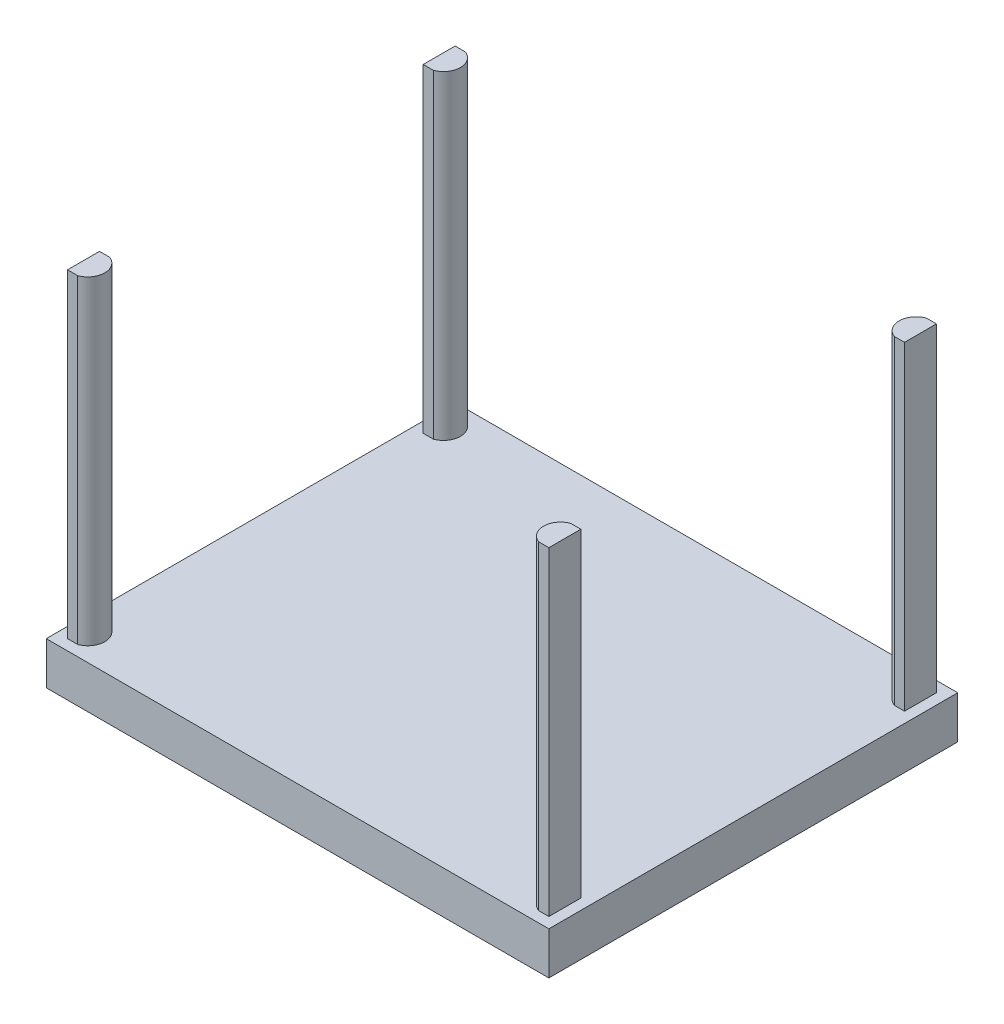
ISO-10303-21;
HEADER;
FILE_DESCRIPTION(('STEP AP214'),'2;1');
FILE_NAME('part.step','',(''),(''),'','','');
FILE_SCHEMA(('AUTOMOTIVE_DESIGN { 1 0 10303 214 1 1 1 1 }'));
ENDSEC;
DATA;
#1=APPLICATION_CONTEXT('core data for automotive mechanical design processes');
#2=APPLICATION_PROTOCOL_DEFINITION('international standard','automotive_design',2000,#1);
#3=PRODUCT_CONTEXT('',#1,'mechanical');
#4=PRODUCT('Part','Part','',(#3));
#5=PRODUCT_RELATED_PRODUCT_CATEGORY('part','',(#4));
#6=PRODUCT_DEFINITION_FORMATION('','',#4);
#7=PRODUCT_DEFINITION_CONTEXT('part definition',#1,'design');
#8=PRODUCT_DEFINITION('design','',#6,#7);
#9=PRODUCT_DEFINITION_SHAPE('','',#8);
#10=(LENGTH_UNIT() NAMED_UNIT(*) SI_UNIT(.MILLI.,.METRE.));
#11=(NAMED_UNIT(*) PLANE_ANGLE_UNIT() SI_UNIT($,.RADIAN.));
#12=(NAMED_UNIT(*) SI_UNIT($,.STERADIAN.) SOLID_ANGLE_UNIT());
#13=UNCERTAINTY_MEASURE_WITH_UNIT(LENGTH_MEASURE(1.E-05),#10,'distance_accuracy_value','');
#14=(GEOMETRIC_REPRESENTATION_CONTEXT(3) GLOBAL_UNCERTAINTY_ASSIGNED_CONTEXT((#13)) GLOBAL_UNIT_ASSIGNED_CONTEXT((#10,
#11,#12)) REPRESENTATION_CONTEXT('',''));
#15=CARTESIAN_POINT('',(0.,0.,0.));
#16=DIRECTION('',(0.,0.,1.));
#17=DIRECTION('',(1.,0.,0.));
#18=AXIS2_PLACEMENT_3D('',#15,#16,#17);
#19=CARTESIAN_POINT('',(0.,20.,0.));
#20=DIRECTION('',(0.,1.,0.));
#21=DIRECTION('',(0.,0.,1.));
#22=AXIS2_PLACEMENT_3D('',#19,#20,#21);
#23=PLANE('',#22);
#24=DIRECTION('',(0.,0.,1.));
#25=VECTOR('',#24,1.);
#26=CARTESIAN_POINT('',(-59.,20.,-48.));
#27=LINE('',#26,#25);
#28=CARTESIAN_POINT('',(-59.,20.,-48.));
#29=VERTEX_POINT('',#28);
#30=CARTESIAN_POINT('',(-59.,20.,144.));
#31=VERTEX_POINT('',#30);
#32=EDGE_CURVE('E326',#29,#31,#27,.T.);
#33=ORIENTED_EDGE('',*,*,#32,.T.);
#34=DIRECTION('',(-1.,0.,0.));
#35=VECTOR('',#34,1.);
#36=CARTESIAN_POINT('',(-59.,20.,144.));
#37=LINE('',#36,#35);
#38=CARTESIAN_POINT('',(177.,20.,144.));
#39=VERTEX_POINT('',#38);
#40=EDGE_CURVE('E286',#39,#31,#37,.T.);
#41=ORIENTED_EDGE('',*,*,#40,.F.);
#42=DIRECTION('',(0.,0.,1.));
#43=VECTOR('',#42,1.);
#44=CARTESIAN_POINT('',(177.,20.,-48.));
#45=LINE('',#44,#43);
#46=CARTESIAN_POINT('',(177.,20.,-48.));
#47=VERTEX_POINT('',#46);
#48=EDGE_CURVE('E246',#47,#39,#45,.T.);
#49=ORIENTED_EDGE('',*,*,#48,.F.);
#50=DIRECTION('',(-1.,0.,0.));
#51=VECTOR('',#50,1.);
#52=CARTESIAN_POINT('',(-59.,20.,-48.));
#53=LINE('',#52,#51);
#54=EDGE_CURVE('E45',#47,#29,#53,.T.);
#55=ORIENTED_EDGE('',*,*,#54,.T.);
#56=EDGE_LOOP('',(#33,#41,#49,#55));
#57=FACE_BOUND('',#56,.T.);
#58=DIRECTION('',(1.,0.,0.));
#59=VECTOR('',#58,1.);
#60=CARTESIAN_POINT('',(-1.24740713317382E-13,20.,-43.0000000000001));
#61=LINE('',#60,#59);
#62=CARTESIAN_POINT('',(-54.,20.,-43.));
#63=VERTEX_POINT('',#62);
#64=CARTESIAN_POINT('',(-49.216117818585,20.,-43.));
#65=VERTEX_POINT('',#64);
#66=EDGE_CURVE('E319',#63,#65,#61,.T.);
#67=ORIENTED_EDGE('',*,*,#66,.T.);
#68=CARTESIAN_POINT('',(-52.,20.,-35.5));
#69=DIRECTION('',(0.,1.,0.));
#70=DIRECTION('',(0.,0.,1.));
#71=AXIS2_PLACEMENT_3D('',#68,#69,#70);
#72=CIRCLE('',#71,8.);
#73=CARTESIAN_POINT('',(-49.216117818585,20.,-28.));
#74=VERTEX_POINT('',#73);
#75=EDGE_CURVE('E322',#65,#74,#72,.F.);
#76=ORIENTED_EDGE('',*,*,#75,.T.);
#77=DIRECTION('',(-1.,0.,0.));
#78=VECTOR('',#77,1.);
#79=CARTESIAN_POINT('',(-1.01533138746707E-13,20.,-28.0000000000002));
#80=LINE('',#79,#78);
#81=CARTESIAN_POINT('',(-54.,20.,-28.));
#82=VERTEX_POINT('',#81);
#83=EDGE_CURVE('E313',#74,#82,#80,.T.);
#84=ORIENTED_EDGE('',*,*,#83,.T.);
#85=DIRECTION('',(0.,0.,-1.));
#86=VECTOR('',#85,1.);
#87=CARTESIAN_POINT('',(-54.,20.,0.));
#88=LINE('',#87,#86);
#89=EDGE_CURVE('E316',#82,#63,#88,.T.);
#90=ORIENTED_EDGE('',*,*,#89,.T.);
#91=EDGE_LOOP('',(#67,#76,#84,#90));
#92=FACE_BOUND('',#91,.T.);
#93=DIRECTION('',(1.,0.,0.));
#94=VECTOR('',#93,1.);
#95=CARTESIAN_POINT('',(-1.03335989749397E-13,20.,139.));
#96=LINE('',#95,#94);
#97=CARTESIAN_POINT('',(-54.,20.,139.));
#98=VERTEX_POINT('',#97);
#99=CARTESIAN_POINT('',(-49.216117818585,20.,139.));
#100=VERTEX_POINT('',#99);
#101=EDGE_CURVE('E279',#98,#100,#96,.T.);
#102=ORIENTED_EDGE('',*,*,#101,.F.);
#103=DIRECTION('',(0.,0.,1.));
#104=VECTOR('',#103,1.);
#105=CARTESIAN_POINT('',(-54.,20.,96.));
#106=LINE('',#105,#104);
#107=CARTESIAN_POINT('',(-54.,20.,124.));
#108=VERTEX_POINT('',#107);
#109=EDGE_CURVE('E276',#108,#98,#106,.T.);
#110=ORIENTED_EDGE('',*,*,#109,.F.);
#111=DIRECTION('',(-1.,0.,0.));
#112=VECTOR('',#111,1.);
#113=CARTESIAN_POINT('',(0.,20.,124.));
#114=LINE('',#113,#112);
#115=CARTESIAN_POINT('',(-49.216117818585,20.,124.));
#116=VERTEX_POINT('',#115);
#117=EDGE_CURVE('E273',#116,#108,#114,.T.);
#118=ORIENTED_EDGE('',*,*,#117,.F.);
#119=CARTESIAN_POINT('',(-52.,20.,131.5));
#120=DIRECTION('',(0.,-1.,0.));
#121=DIRECTION('',(0.,0.,-1.));
#122=AXIS2_PLACEMENT_3D('',#119,#120,#121);
#123=CIRCLE('',#122,8.);
#124=EDGE_CURVE('E282',#100,#116,#123,.F.);
#125=ORIENTED_EDGE('',*,*,#124,.F.);
#126=EDGE_LOOP('',(#102,#110,#118,#125));
#127=FACE_BOUND('',#126,.T.);
#128=DIRECTION('',(-1.,0.,0.));
#129=VECTOR('',#128,1.);
#130=CARTESIAN_POINT('',(118.,20.,-43.0000000000001));
#131=LINE('',#130,#129);
#132=CARTESIAN_POINT('',(172.,20.,-43.));
#133=VERTEX_POINT('',#132);
#134=CARTESIAN_POINT('',(167.216117818585,20.,-43.));
#135=VERTEX_POINT('',#134);
#136=EDGE_CURVE('E239',#133,#135,#131,.T.);
#137=ORIENTED_EDGE('',*,*,#136,.F.);
#138=DIRECTION('',(0.,0.,-1.));
#139=VECTOR('',#138,1.);
#140=CARTESIAN_POINT('',(172.,20.,0.));
#141=LINE('',#140,#139);
#142=CARTESIAN_POINT('',(172.,20.,-28.));
#143=VERTEX_POINT('',#142);
#144=EDGE_CURVE('E236',#143,#133,#141,.T.);
#145=ORIENTED_EDGE('',*,*,#144,.F.);
#146=DIRECTION('',(1.,0.,0.));
#147=VECTOR('',#146,1.);
#148=CARTESIAN_POINT('',(118.,20.,-28.0000000000002));
#149=LINE('',#148,#147);
#150=CARTESIAN_POINT('',(167.216117818585,20.,-28.));
#151=VERTEX_POINT('',#150);
#152=EDGE_CURVE('E233',#151,#143,#149,.T.);
#153=ORIENTED_EDGE('',*,*,#152,.F.);
#154=CARTESIAN_POINT('',(170.,20.,-35.5));
#155=DIRECTION('',(0.,-1.,0.));
#156=DIRECTION('',(0.,0.,1.));
#157=AXIS2_PLACEMENT_3D('',#154,#155,#156);
#158=CIRCLE('',#157,8.);
#159=EDGE_CURVE('E242',#135,#151,#158,.F.);
#160=ORIENTED_EDGE('',*,*,#159,.F.);
#161=EDGE_LOOP('',(#137,#145,#153,#160));
#162=FACE_BOUND('',#161,.T.);
#163=DIRECTION('',(-1.,0.,0.));
#164=VECTOR('',#163,1.);
#165=CARTESIAN_POINT('',(118.,20.,139.));
#166=LINE('',#165,#164);
#167=CARTESIAN_POINT('',(172.,20.,139.));
#168=VERTEX_POINT('',#167);
#169=CARTESIAN_POINT('',(167.216117818585,20.,139.));
#170=VERTEX_POINT('',#169);
#171=EDGE_CURVE('E208',#168,#170,#166,.T.);
#172=ORIENTED_EDGE('',*,*,#171,.T.);
#173=CARTESIAN_POINT('',(170.,20.,131.5));
#174=DIRECTION('',(0.,1.,0.));
#175=DIRECTION('',(0.,0.,-1.));
#176=AXIS2_PLACEMENT_3D('',#173,#174,#175);
#177=CIRCLE('',#176,8.);
#178=CARTESIAN_POINT('',(167.216117818585,20.,124.));
#179=VERTEX_POINT('',#178);
#180=EDGE_CURVE('E195',#170,#179,#177,.F.);
#181=ORIENTED_EDGE('',*,*,#180,.T.);
#182=DIRECTION('',(1.,0.,0.));
#183=VECTOR('',#182,1.);
#184=CARTESIAN_POINT('',(118.,20.,124.));
#185=LINE('',#184,#183);
#186=CARTESIAN_POINT('',(172.,20.,124.));
#187=VERTEX_POINT('',#186);
#188=EDGE_CURVE('E197',#179,#187,#185,.T.);
#189=ORIENTED_EDGE('',*,*,#188,.T.);
#190=DIRECTION('',(0.,0.,1.));
#191=VECTOR('',#190,1.);
#192=CARTESIAN_POINT('',(172.,20.,96.));
#193=LINE('',#192,#191);
#194=EDGE_CURVE('E200',#187,#168,#193,.T.);
#195=ORIENTED_EDGE('',*,*,#194,.T.);
#196=EDGE_LOOP('',(#172,#181,#189,#195));
#197=FACE_BOUND('',#196,.T.);
#198=ADVANCED_FACE('F37',(#57,#92,#127,#162,#197),#23,.T.);
#199=CARTESIAN_POINT('',(-59.,20.,-48.));
#200=DIRECTION('',(1.,0.,0.));
#201=DIRECTION('',(0.,0.,-1.));
#202=AXIS2_PLACEMENT_3D('',#199,#200,#201);
#203=PLANE('',#202);
#204=DIRECTION('',(0.,0.,1.));
#205=VECTOR('',#204,1.);
#206=CARTESIAN_POINT('',(-59.,0.,-48.));
#207=LINE('',#206,#205);
#208=CARTESIAN_POINT('',(-59.,0.,-48.));
#209=VERTEX_POINT('',#208);
#210=CARTESIAN_POINT('',(-59.,0.,144.));
#211=VERTEX_POINT('',#210);
#212=EDGE_CURVE('E325',#209,#211,#207,.T.);
#213=ORIENTED_EDGE('',*,*,#212,.T.);
#214=DIRECTION('',(0.,-1.,0.));
#215=VECTOR('',#214,1.);
#216=CARTESIAN_POINT('',(-59.,20.,144.));
#217=LINE('',#216,#215);
#218=EDGE_CURVE('E289',#31,#211,#217,.T.);
#219=ORIENTED_EDGE('',*,*,#218,.F.);
#220=ORIENTED_EDGE('',*,*,#32,.F.);
#221=DIRECTION('',(0.,-1.,0.));
#222=VECTOR('',#221,1.);
#223=CARTESIAN_POINT('',(-59.,20.,-48.));
#224=LINE('',#223,#222);
#225=EDGE_CURVE('E11',#29,#209,#224,.T.);
#226=ORIENTED_EDGE('',*,*,#225,.T.);
#227=EDGE_LOOP('',(#213,#219,#220,#226));
#228=FACE_BOUND('',#227,.T.);
#229=ADVANCED_FACE('F39',(#228),#203,.F.);
#230=CARTESIAN_POINT('',(-59.,20.,-48.));
#231=DIRECTION('',(0.,0.,1.));
#232=DIRECTION('',(1.,0.,0.));
#233=AXIS2_PLACEMENT_3D('',#230,#231,#232);
#234=PLANE('',#233);
#235=DIRECTION('',(-1.,0.,0.));
#236=VECTOR('',#235,1.);
#237=CARTESIAN_POINT('',(-59.,0.,-48.));
#238=LINE('',#237,#236);
#239=CARTESIAN_POINT('',(177.,0.,-48.));
#240=VERTEX_POINT('',#239);
#241=EDGE_CURVE('E328',#240,#209,#238,.T.);
#242=ORIENTED_EDGE('',*,*,#241,.T.);
#243=ORIENTED_EDGE('',*,*,#225,.F.);
#244=ORIENTED_EDGE('',*,*,#54,.F.);
#245=DIRECTION('',(0.,-1.,0.));
#246=VECTOR('',#245,1.);
#247=CARTESIAN_POINT('',(177.,20.,-48.));
#248=LINE('',#247,#246);
#249=EDGE_CURVE('E249',#47,#240,#248,.T.);
#250=ORIENTED_EDGE('',*,*,#249,.T.);
#251=EDGE_LOOP('',(#242,#243,#244,#250));
#252=FACE_BOUND('',#251,.T.);
#253=ADVANCED_FACE('F331',(#252),#234,.F.);
#254=CARTESIAN_POINT('',(0.,0.,0.));
#255=DIRECTION('',(0.,1.,0.));
#256=DIRECTION('',(0.,0.,1.));
#257=AXIS2_PLACEMENT_3D('',#254,#255,#256);
#258=PLANE('',#257);
#259=ORIENTED_EDGE('',*,*,#212,.F.);
#260=ORIENTED_EDGE('',*,*,#241,.F.);
#261=DIRECTION('',(0.,0.,1.));
#262=VECTOR('',#261,1.);
#263=CARTESIAN_POINT('',(177.,0.,-48.));
#264=LINE('',#263,#262);
#265=CARTESIAN_POINT('',(177.,0.,144.));
#266=VERTEX_POINT('',#265);
#267=EDGE_CURVE('E245',#240,#266,#264,.T.);
#268=ORIENTED_EDGE('',*,*,#267,.T.);
#269=DIRECTION('',(-1.,0.,0.));
#270=VECTOR('',#269,1.);
#271=CARTESIAN_POINT('',(-59.,0.,144.));
#272=LINE('',#271,#270);
#273=EDGE_CURVE('E285',#266,#211,#272,.T.);
#274=ORIENTED_EDGE('',*,*,#273,.T.);
#275=EDGE_LOOP('',(#259,#260,#268,#274));
#276=FACE_BOUND('',#275,.T.);
#277=ADVANCED_FACE('F339',(#276),#258,.F.);
#278=CARTESIAN_POINT('',(-52.,170.,-35.5));
#279=DIRECTION('',(0.,-1.,0.));
#280=DIRECTION('',(0.,0.,-1.));
#281=AXIS2_PLACEMENT_3D('',#278,#279,#280);
#282=CYLINDRICAL_SURFACE('',#281,8.);
#283=ORIENTED_EDGE('',*,*,#75,.F.);
#284=DIRECTION('',(0.,-1.,0.));
#285=VECTOR('',#284,1.);
#286=CARTESIAN_POINT('',(-49.216117818585,170.,-43.));
#287=LINE('',#286,#285);
#288=CARTESIAN_POINT('',(-49.216117818585,170.,-43.));
#289=VERTEX_POINT('',#288);
#290=EDGE_CURVE('E310',#289,#65,#287,.T.);
#291=ORIENTED_EDGE('',*,*,#290,.F.);
#292=CARTESIAN_POINT('',(-52.,170.,-35.5));
#293=DIRECTION('',(0.,1.,0.));
#294=DIRECTION('',(0.,0.,-1.));
#295=AXIS2_PLACEMENT_3D('',#292,#293,#294);
#296=CIRCLE('',#295,8.);
#297=CARTESIAN_POINT('',(-49.216117818585,170.,-28.));
#298=VERTEX_POINT('',#297);
#299=EDGE_CURVE('E294',#298,#289,#296,.T.);
#300=ORIENTED_EDGE('',*,*,#299,.F.);
#301=DIRECTION('',(0.,-1.,0.));
#302=VECTOR('',#301,1.);
#303=CARTESIAN_POINT('',(-49.216117818585,170.,-28.));
#304=LINE('',#303,#302);
#305=EDGE_CURVE('E303',#298,#74,#304,.T.);
#306=ORIENTED_EDGE('',*,*,#305,.T.);
#307=EDGE_LOOP('',(#283,#291,#300,#306));
#308=FACE_BOUND('',#307,.T.);
#309=ADVANCED_FACE('F367',(#308),#282,.T.);
#310=CARTESIAN_POINT('',(-49.216117818585,170.,-43.));
#311=DIRECTION('',(0.,0.,1.));
#312=DIRECTION('',(1.,0.,0.));
#313=AXIS2_PLACEMENT_3D('',#310,#311,#312);
#314=PLANE('',#313);
#315=ORIENTED_EDGE('',*,*,#66,.F.);
#316=DIRECTION('',(0.,-1.,0.));
#317=VECTOR('',#316,1.);
#318=CARTESIAN_POINT('',(-54.,170.,-43.));
#319=LINE('',#318,#317);
#320=CARTESIAN_POINT('',(-54.,170.,-43.));
#321=VERTEX_POINT('',#320);
#322=EDGE_CURVE('E307',#321,#63,#319,.T.);
#323=ORIENTED_EDGE('',*,*,#322,.F.);
#324=DIRECTION('',(-1.,0.,0.));
#325=VECTOR('',#324,1.);
#326=CARTESIAN_POINT('',(-49.216117818585,170.,-43.));
#327=LINE('',#326,#325);
#328=EDGE_CURVE('E297',#289,#321,#327,.T.);
#329=ORIENTED_EDGE('',*,*,#328,.F.);
#330=ORIENTED_EDGE('',*,*,#290,.T.);
#331=EDGE_LOOP('',(#315,#323,#329,#330));
#332=FACE_BOUND('',#331,.T.);
#333=ADVANCED_FACE('F386',(#332),#314,.F.);
#334=CARTESIAN_POINT('',(-54.,170.,-28.));
#335=DIRECTION('',(1.,0.,0.));
#336=DIRECTION('',(0.,0.,-1.));
#337=AXIS2_PLACEMENT_3D('',#334,#335,#336);
#338=PLANE('',#337);
#339=ORIENTED_EDGE('',*,*,#89,.F.);
#340=DIRECTION('',(0.,-1.,0.));
#341=VECTOR('',#340,1.);
#342=CARTESIAN_POINT('',(-54.,170.,-28.));
#343=LINE('',#342,#341);
#344=CARTESIAN_POINT('',(-54.,170.,-28.));
#345=VERTEX_POINT('',#344);
#346=EDGE_CURVE('E52',#345,#82,#343,.T.);
#347=ORIENTED_EDGE('',*,*,#346,.F.);
#348=DIRECTION('',(0.,0.,1.));
#349=VECTOR('',#348,1.);
#350=CARTESIAN_POINT('',(-54.,170.,-28.));
#351=LINE('',#350,#349);
#352=EDGE_CURVE('E299',#321,#345,#351,.T.);
#353=ORIENTED_EDGE('',*,*,#352,.F.);
#354=ORIENTED_EDGE('',*,*,#322,.T.);
#355=EDGE_LOOP('',(#339,#347,#353,#354));
#356=FACE_BOUND('',#355,.T.);
#357=ADVANCED_FACE('F393',(#356),#338,.F.);
#358=CARTESIAN_POINT('',(-49.216117818585,170.,-28.));
#359=DIRECTION('',(0.,0.,-1.));
#360=DIRECTION('',(-1.,0.,0.));
#361=AXIS2_PLACEMENT_3D('',#358,#359,#360);
#362=PLANE('',#361);
#363=ORIENTED_EDGE('',*,*,#83,.F.);
#364=ORIENTED_EDGE('',*,*,#305,.F.);
#365=DIRECTION('',(1.,0.,0.));
#366=VECTOR('',#365,1.);
#367=CARTESIAN_POINT('',(-49.216117818585,170.,-28.));
#368=LINE('',#367,#366);
#369=EDGE_CURVE('E301',#345,#298,#368,.T.);
#370=ORIENTED_EDGE('',*,*,#369,.F.);
#371=ORIENTED_EDGE('',*,*,#346,.T.);
#372=EDGE_LOOP('',(#363,#364,#370,#371));
#373=FACE_BOUND('',#372,.T.);
#374=ADVANCED_FACE('F401',(#373),#362,.F.);
#375=CARTESIAN_POINT('',(-52.,170.,-35.5));
#376=DIRECTION('',(0.,-1.,0.));
#377=DIRECTION('',(0.,0.,-1.));
#378=AXIS2_PLACEMENT_3D('',#375,#376,#377);
#379=PLANE('',#378);
#380=ORIENTED_EDGE('',*,*,#299,.T.);
#381=ORIENTED_EDGE('',*,*,#328,.T.);
#382=ORIENTED_EDGE('',*,*,#352,.T.);
#383=ORIENTED_EDGE('',*,*,#369,.T.);
#384=EDGE_LOOP('',(#380,#381,#382,#383));
#385=FACE_BOUND('',#384,.T.);
#386=ADVANCED_FACE('F411',(#385),#379,.F.);
#387=CARTESIAN_POINT('',(-59.,20.,144.));
#388=DIRECTION('',(0.,0.,-1.));
#389=DIRECTION('',(1.,0.,0.));
#390=AXIS2_PLACEMENT_3D('',#387,#388,#389);
#391=PLANE('',#390);
#392=ORIENTED_EDGE('',*,*,#273,.F.);
#393=DIRECTION('',(0.,-1.,0.));
#394=VECTOR('',#393,1.);
#395=CARTESIAN_POINT('',(177.,20.,144.));
#396=LINE('',#395,#394);
#397=EDGE_CURVE('E211',#39,#266,#396,.T.);
#398=ORIENTED_EDGE('',*,*,#397,.F.);
#399=ORIENTED_EDGE('',*,*,#40,.T.);
#400=ORIENTED_EDGE('',*,*,#218,.T.);
#401=EDGE_LOOP('',(#392,#398,#399,#400));
#402=FACE_BOUND('',#401,.T.);
#403=ADVANCED_FACE('F342',(#402),#391,.F.);
#404=CARTESIAN_POINT('',(-52.,170.,131.5));
#405=DIRECTION('',(0.,-1.,0.));
#406=DIRECTION('',(0.,0.,1.));
#407=AXIS2_PLACEMENT_3D('',#404,#405,#406);
#408=CYLINDRICAL_SURFACE('',#407,8.);
#409=ORIENTED_EDGE('',*,*,#124,.T.);
#410=DIRECTION('',(0.,-1.,0.));
#411=VECTOR('',#410,1.);
#412=CARTESIAN_POINT('',(-49.216117818585,170.,124.));
#413=LINE('',#412,#411);
#414=CARTESIAN_POINT('',(-49.216117818585,170.,124.));
#415=VERTEX_POINT('',#414);
#416=EDGE_CURVE('E265',#415,#116,#413,.T.);
#417=ORIENTED_EDGE('',*,*,#416,.F.);
#418=CARTESIAN_POINT('',(-52.,170.,131.5));
#419=DIRECTION('',(0.,-1.,0.));
#420=DIRECTION('',(0.,0.,1.));
#421=AXIS2_PLACEMENT_3D('',#418,#419,#420);
#422=CIRCLE('',#421,8.);
#423=CARTESIAN_POINT('',(-49.216117818585,170.,139.));
#424=VERTEX_POINT('',#423);
#425=EDGE_CURVE('E254',#415,#424,#422,.T.);
#426=ORIENTED_EDGE('',*,*,#425,.T.);
#427=DIRECTION('',(0.,-1.,0.));
#428=VECTOR('',#427,1.);
#429=CARTESIAN_POINT('',(-49.216117818585,170.,139.));
#430=LINE('',#429,#428);
#431=EDGE_CURVE('E271',#424,#100,#430,.T.);
#432=ORIENTED_EDGE('',*,*,#431,.T.);
#433=EDGE_LOOP('',(#409,#417,#426,#432));
#434=FACE_BOUND('',#433,.T.);
#435=ADVANCED_FACE('F423',(#434),#408,.T.);
#436=CARTESIAN_POINT('',(-49.216117818585,170.,139.));
#437=DIRECTION('',(0.,0.,-1.));
#438=DIRECTION('',(1.,0.,0.));
#439=AXIS2_PLACEMENT_3D('',#436,#437,#438);
#440=PLANE('',#439);
#441=ORIENTED_EDGE('',*,*,#101,.T.);
#442=ORIENTED_EDGE('',*,*,#431,.F.);
#443=DIRECTION('',(-1.,0.,0.));
#444=VECTOR('',#443,1.);
#445=CARTESIAN_POINT('',(-49.216117818585,170.,139.));
#446=LINE('',#445,#444);
#447=CARTESIAN_POINT('',(-54.,170.,139.));
#448=VERTEX_POINT('',#447);
#449=EDGE_CURVE('E257',#424,#448,#446,.T.);
#450=ORIENTED_EDGE('',*,*,#449,.T.);
#451=DIRECTION('',(0.,-1.,0.));
#452=VECTOR('',#451,1.);
#453=CARTESIAN_POINT('',(-54.,170.,139.));
#454=LINE('',#453,#452);
#455=EDGE_CURVE('E269',#448,#98,#454,.T.);
#456=ORIENTED_EDGE('',*,*,#455,.T.);
#457=EDGE_LOOP('',(#441,#442,#450,#456));
#458=FACE_BOUND('',#457,.T.);
#459=ADVANCED_FACE('F430',(#458),#440,.F.);
#460=CARTESIAN_POINT('',(-54.,170.,124.));
#461=DIRECTION('',(1.,0.,0.));
#462=DIRECTION('',(0.,0.,1.));
#463=AXIS2_PLACEMENT_3D('',#460,#461,#462);
#464=PLANE('',#463);
#465=ORIENTED_EDGE('',*,*,#109,.T.);
#466=ORIENTED_EDGE('',*,*,#455,.F.);
#467=DIRECTION('',(0.,0.,-1.));
#468=VECTOR('',#467,1.);
#469=CARTESIAN_POINT('',(-54.,170.,124.));
#470=LINE('',#469,#468);
#471=CARTESIAN_POINT('',(-54.,170.,124.));
#472=VERTEX_POINT('',#471);
#473=EDGE_CURVE('E260',#448,#472,#470,.T.);
#474=ORIENTED_EDGE('',*,*,#473,.T.);
#475=DIRECTION('',(0.,-1.,0.));
#476=VECTOR('',#475,1.);
#477=CARTESIAN_POINT('',(-54.,170.,124.));
#478=LINE('',#477,#476);
#479=EDGE_CURVE('E267',#472,#108,#478,.T.);
#480=ORIENTED_EDGE('',*,*,#479,.T.);
#481=EDGE_LOOP('',(#465,#466,#474,#480));
#482=FACE_BOUND('',#481,.T.);
#483=ADVANCED_FACE('F439',(#482),#464,.F.);
#484=CARTESIAN_POINT('',(-49.216117818585,170.,124.));
#485=DIRECTION('',(0.,0.,1.));
#486=DIRECTION('',(-1.,0.,0.));
#487=AXIS2_PLACEMENT_3D('',#484,#485,#486);
#488=PLANE('',#487);
#489=ORIENTED_EDGE('',*,*,#117,.T.);
#490=ORIENTED_EDGE('',*,*,#479,.F.);
#491=DIRECTION('',(1.,0.,0.));
#492=VECTOR('',#491,1.);
#493=CARTESIAN_POINT('',(-49.216117818585,170.,124.));
#494=LINE('',#493,#492);
#495=EDGE_CURVE('E263',#472,#415,#494,.T.);
#496=ORIENTED_EDGE('',*,*,#495,.T.);
#497=ORIENTED_EDGE('',*,*,#416,.T.);
#498=EDGE_LOOP('',(#489,#490,#496,#497));
#499=FACE_BOUND('',#498,.T.);
#500=ADVANCED_FACE('F357',(#499),#488,.F.);
#501=CARTESIAN_POINT('',(-52.,170.,131.5));
#502=DIRECTION('',(0.,-1.,0.));
#503=DIRECTION('',(0.,0.,1.));
#504=AXIS2_PLACEMENT_3D('',#501,#502,#503);
#505=PLANE('',#504);
#506=ORIENTED_EDGE('',*,*,#425,.F.);
#507=ORIENTED_EDGE('',*,*,#495,.F.);
#508=ORIENTED_EDGE('',*,*,#473,.F.);
#509=ORIENTED_EDGE('',*,*,#449,.F.);
#510=EDGE_LOOP('',(#506,#507,#508,#509));
#511=FACE_BOUND('',#510,.T.);
#512=ADVANCED_FACE('F348',(#511),#505,.F.);
#513=CARTESIAN_POINT('',(177.,20.,-48.));
#514=DIRECTION('',(-1.,0.,0.));
#515=DIRECTION('',(0.,0.,-1.));
#516=AXIS2_PLACEMENT_3D('',#513,#514,#515);
#517=PLANE('',#516);
#518=ORIENTED_EDGE('',*,*,#267,.F.);
#519=ORIENTED_EDGE('',*,*,#249,.F.);
#520=ORIENTED_EDGE('',*,*,#48,.T.);
#521=ORIENTED_EDGE('',*,*,#397,.T.);
#522=EDGE_LOOP('',(#518,#519,#520,#521));
#523=FACE_BOUND('',#522,.T.);
#524=ADVANCED_FACE('F345',(#523),#517,.F.);
#525=CARTESIAN_POINT('',(170.,170.,-35.5));
#526=DIRECTION('',(0.,-1.,0.));
#527=DIRECTION('',(0.,0.,-1.));
#528=AXIS2_PLACEMENT_3D('',#525,#526,#527);
#529=CYLINDRICAL_SURFACE('',#528,8.);
#530=ORIENTED_EDGE('',*,*,#159,.T.);
#531=DIRECTION('',(0.,-1.,0.));
#532=VECTOR('',#531,1.);
#533=CARTESIAN_POINT('',(167.216117818585,170.,-28.));
#534=LINE('',#533,#532);
#535=CARTESIAN_POINT('',(167.216117818585,170.,-28.));
#536=VERTEX_POINT('',#535);
#537=EDGE_CURVE('E225',#536,#151,#534,.T.);
#538=ORIENTED_EDGE('',*,*,#537,.F.);
#539=CARTESIAN_POINT('',(170.,170.,-35.5));
#540=DIRECTION('',(0.,-1.,0.));
#541=DIRECTION('',(0.,0.,-1.));
#542=AXIS2_PLACEMENT_3D('',#539,#540,#541);
#543=CIRCLE('',#542,8.);
#544=CARTESIAN_POINT('',(167.216117818585,170.,-43.));
#545=VERTEX_POINT('',#544);
#546=EDGE_CURVE('E214',#536,#545,#543,.T.);
#547=ORIENTED_EDGE('',*,*,#546,.T.);
#548=DIRECTION('',(0.,-1.,0.));
#549=VECTOR('',#548,1.);
#550=CARTESIAN_POINT('',(167.216117818585,170.,-43.));
#551=LINE('',#550,#549);
#552=EDGE_CURVE('E231',#545,#135,#551,.T.);
#553=ORIENTED_EDGE('',*,*,#552,.T.);
#554=EDGE_LOOP('',(#530,#538,#547,#553));
#555=FACE_BOUND('',#554,.T.);
#556=ADVANCED_FACE('F347',(#555),#529,.T.);
#557=CARTESIAN_POINT('',(167.216117818585,170.,-43.));
#558=DIRECTION('',(0.,0.,1.));
#559=DIRECTION('',(-1.,0.,0.));
#560=AXIS2_PLACEMENT_3D('',#557,#558,#559);
#561=PLANE('',#560);
#562=ORIENTED_EDGE('',*,*,#136,.T.);
#563=ORIENTED_EDGE('',*,*,#552,.F.);
#564=DIRECTION('',(1.,0.,0.));
#565=VECTOR('',#564,1.);
#566=CARTESIAN_POINT('',(167.216117818585,170.,-43.));
#567=LINE('',#566,#565);
#568=CARTESIAN_POINT('',(172.,170.,-43.));
#569=VERTEX_POINT('',#568);
#570=EDGE_CURVE('E217',#545,#569,#567,.T.);
#571=ORIENTED_EDGE('',*,*,#570,.T.);
#572=DIRECTION('',(0.,-1.,0.));
#573=VECTOR('',#572,1.);
#574=CARTESIAN_POINT('',(172.,170.,-43.));
#575=LINE('',#574,#573);
#576=EDGE_CURVE('E229',#569,#133,#575,.T.);
#577=ORIENTED_EDGE('',*,*,#576,.T.);
#578=EDGE_LOOP('',(#562,#563,#571,#577));
#579=FACE_BOUND('',#578,.T.);
#580=ADVANCED_FACE('F354',(#579),#561,.F.);
#581=CARTESIAN_POINT('',(172.,170.,-28.));
#582=DIRECTION('',(-1.,0.,0.));
#583=DIRECTION('',(0.,0.,-1.));
#584=AXIS2_PLACEMENT_3D('',#581,#582,#583);
#585=PLANE('',#584);
#586=ORIENTED_EDGE('',*,*,#144,.T.);
#587=ORIENTED_EDGE('',*,*,#576,.F.);
#588=DIRECTION('',(0.,0.,1.));
#589=VECTOR('',#588,1.);
#590=CARTESIAN_POINT('',(172.,170.,-28.));
#591=LINE('',#590,#589);
#592=CARTESIAN_POINT('',(172.,170.,-28.));
#593=VERTEX_POINT('',#592);
#594=EDGE_CURVE('E220',#569,#593,#591,.T.);
#595=ORIENTED_EDGE('',*,*,#594,.T.);
#596=DIRECTION('',(0.,-1.,0.));
#597=VECTOR('',#596,1.);
#598=CARTESIAN_POINT('',(172.,170.,-28.));
#599=LINE('',#598,#597);
#600=EDGE_CURVE('E227',#593,#143,#599,.T.);
#601=ORIENTED_EDGE('',*,*,#600,.T.);
#602=EDGE_LOOP('',(#586,#587,#595,#601));
#603=FACE_BOUND('',#602,.T.);
#604=ADVANCED_FACE('F489',(#603),#585,.F.);
#605=CARTESIAN_POINT('',(167.216117818585,170.,-28.));
#606=DIRECTION('',(0.,0.,-1.));
#607=DIRECTION('',(1.,0.,0.));
#608=AXIS2_PLACEMENT_3D('',#605,#606,#607);
#609=PLANE('',#608);
#610=ORIENTED_EDGE('',*,*,#152,.T.);
#611=ORIENTED_EDGE('',*,*,#600,.F.);
#612=DIRECTION('',(-1.,0.,0.));
#613=VECTOR('',#612,1.);
#614=CARTESIAN_POINT('',(167.216117818585,170.,-28.));
#615=LINE('',#614,#613);
#616=EDGE_CURVE('E223',#593,#536,#615,.T.);
#617=ORIENTED_EDGE('',*,*,#616,.T.);
#618=ORIENTED_EDGE('',*,*,#537,.T.);
#619=EDGE_LOOP('',(#610,#611,#617,#618));
#620=FACE_BOUND('',#619,.T.);
#621=ADVANCED_FACE('F499',(#620),#609,.F.);
#622=CARTESIAN_POINT('',(170.,170.,-35.5));
#623=DIRECTION('',(0.,-1.,0.));
#624=DIRECTION('',(0.,0.,-1.));
#625=AXIS2_PLACEMENT_3D('',#622,#623,#624);
#626=PLANE('',#625);
#627=ORIENTED_EDGE('',*,*,#546,.F.);
#628=ORIENTED_EDGE('',*,*,#616,.F.);
#629=ORIENTED_EDGE('',*,*,#594,.F.);
#630=ORIENTED_EDGE('',*,*,#570,.F.);
#631=EDGE_LOOP('',(#627,#628,#629,#630));
#632=FACE_BOUND('',#631,.T.);
#633=ADVANCED_FACE('F509',(#632),#626,.F.);
#634=CARTESIAN_POINT('',(170.,170.,131.5));
#635=DIRECTION('',(0.,-1.,0.));
#636=DIRECTION('',(0.,0.,1.));
#637=AXIS2_PLACEMENT_3D('',#634,#635,#636);
#638=CYLINDRICAL_SURFACE('',#637,8.);
#639=ORIENTED_EDGE('',*,*,#180,.F.);
#640=DIRECTION('',(0.,-1.,0.));
#641=VECTOR('',#640,1.);
#642=CARTESIAN_POINT('',(167.216117818585,170.,139.));
#643=LINE('',#642,#641);
#644=CARTESIAN_POINT('',(167.216117818585,170.,139.));
#645=VERTEX_POINT('',#644);
#646=EDGE_CURVE('E179',#645,#170,#643,.T.);
#647=ORIENTED_EDGE('',*,*,#646,.F.);
#648=CARTESIAN_POINT('',(170.,170.,131.5));
#649=DIRECTION('',(0.,1.,0.));
#650=DIRECTION('',(0.,0.,1.));
#651=AXIS2_PLACEMENT_3D('',#648,#649,#650);
#652=CIRCLE('',#651,8.);
#653=CARTESIAN_POINT('',(167.216117818585,170.,124.));
#654=VERTEX_POINT('',#653);
#655=EDGE_CURVE('E185',#654,#645,#652,.T.);
#656=ORIENTED_EDGE('',*,*,#655,.F.);
#657=DIRECTION('',(0.,-1.,0.));
#658=VECTOR('',#657,1.);
#659=CARTESIAN_POINT('',(167.216117818585,170.,124.));
#660=LINE('',#659,#658);
#661=EDGE_CURVE('E668',#654,#179,#660,.T.);
#662=ORIENTED_EDGE('',*,*,#661,.T.);
#663=EDGE_LOOP('',(#639,#647,#656,#662));
#664=FACE_BOUND('',#663,.T.);
#665=ADVANCED_FACE('F193',(#664),#638,.T.);
#666=CARTESIAN_POINT('',(167.216117818585,170.,139.));
#667=DIRECTION('',(0.,0.,-1.));
#668=DIRECTION('',(-1.,0.,0.));
#669=AXIS2_PLACEMENT_3D('',#666,#667,#668);
#670=PLANE('',#669);
#671=ORIENTED_EDGE('',*,*,#171,.F.);
#672=DIRECTION('',(0.,-1.,0.));
#673=VECTOR('',#672,1.);
#674=CARTESIAN_POINT('',(172.,170.,139.));
#675=LINE('',#674,#673);
#676=CARTESIAN_POINT('',(172.,170.,139.));
#677=VERTEX_POINT('',#676);
#678=EDGE_CURVE('E181',#677,#168,#675,.T.);
#679=ORIENTED_EDGE('',*,*,#678,.F.);
#680=DIRECTION('',(1.,0.,0.));
#681=VECTOR('',#680,1.);
#682=CARTESIAN_POINT('',(167.216117818585,170.,139.));
#683=LINE('',#682,#681);
#684=EDGE_CURVE('E174',#645,#677,#683,.T.);
#685=ORIENTED_EDGE('',*,*,#684,.F.);
#686=ORIENTED_EDGE('',*,*,#646,.T.);
#687=EDGE_LOOP('',(#671,#679,#685,#686));
#688=FACE_BOUND('',#687,.T.);
#689=ADVANCED_FACE('F177',(#688),#670,.F.);
#690=CARTESIAN_POINT('',(172.,170.,124.));
#691=DIRECTION('',(-1.,0.,0.));
#692=DIRECTION('',(0.,0.,1.));
#693=AXIS2_PLACEMENT_3D('',#690,#691,#692);
#694=PLANE('',#693);
#695=ORIENTED_EDGE('',*,*,#194,.F.);
#696=DIRECTION('',(0.,-1.,0.));
#697=VECTOR('',#696,1.);
#698=CARTESIAN_POINT('',(172.,170.,124.));
#699=LINE('',#698,#697);
#700=CARTESIAN_POINT('',(172.,170.,124.));
#701=VERTEX_POINT('',#700);
#702=EDGE_CURVE('E202',#701,#187,#699,.T.);
#703=ORIENTED_EDGE('',*,*,#702,.F.);
#704=DIRECTION('',(0.,0.,-1.));
#705=VECTOR('',#704,1.);
#706=CARTESIAN_POINT('',(172.,170.,124.));
#707=LINE('',#706,#705);
#708=EDGE_CURVE('E184',#677,#701,#707,.T.);
#709=ORIENTED_EDGE('',*,*,#708,.F.);
#710=ORIENTED_EDGE('',*,*,#678,.T.);
#711=EDGE_LOOP('',(#695,#703,#709,#710));
#712=FACE_BOUND('',#711,.T.);
#713=ADVANCED_FACE('F536',(#712),#694,.F.);
#714=CARTESIAN_POINT('',(167.216117818585,170.,124.));
#715=DIRECTION('',(0.,0.,1.));
#716=DIRECTION('',(1.,0.,0.));
#717=AXIS2_PLACEMENT_3D('',#714,#715,#716);
#718=PLANE('',#717);
#719=ORIENTED_EDGE('',*,*,#188,.F.);
#720=ORIENTED_EDGE('',*,*,#661,.F.);
#721=DIRECTION('',(-1.,0.,0.));
#722=VECTOR('',#721,1.);
#723=CARTESIAN_POINT('',(167.216117818585,170.,124.));
#724=LINE('',#723,#722);
#725=EDGE_CURVE('E189',#701,#654,#724,.T.);
#726=ORIENTED_EDGE('',*,*,#725,.F.);
#727=ORIENTED_EDGE('',*,*,#702,.T.);
#728=EDGE_LOOP('',(#719,#720,#726,#727));
#729=FACE_BOUND('',#728,.T.);
#730=ADVANCED_FACE('F545',(#729),#718,.F.);
#731=CARTESIAN_POINT('',(170.,170.,131.5));
#732=DIRECTION('',(0.,-1.,0.));
#733=DIRECTION('',(0.,0.,1.));
#734=AXIS2_PLACEMENT_3D('',#731,#732,#733);
#735=PLANE('',#734);
#736=ORIENTED_EDGE('',*,*,#655,.T.);
#737=ORIENTED_EDGE('',*,*,#684,.T.);
#738=ORIENTED_EDGE('',*,*,#708,.T.);
#739=ORIENTED_EDGE('',*,*,#725,.T.);
#740=EDGE_LOOP('',(#736,#737,#738,#739));
#741=FACE_BOUND('',#740,.T.);
#742=ADVANCED_FACE('F188',(#741),#735,.F.);
#743=CLOSED_SHELL('',(#198,#229,#253,#277,#309,#333,#357,#374,#386,#403,#435,#459,#483,#500,
#512,#524,#556,#580,#604,#621,#633,#665,#689,#713,#730,#742));
#744=MANIFOLD_SOLID_BREP('B2',#743);
#745=ADVANCED_BREP_SHAPE_REPRESENTATION('',(#18,#744),#14);
#746=SHAPE_DEFINITION_REPRESENTATION(#9,#745);
ENDSEC;
END-ISO-10303-21;
